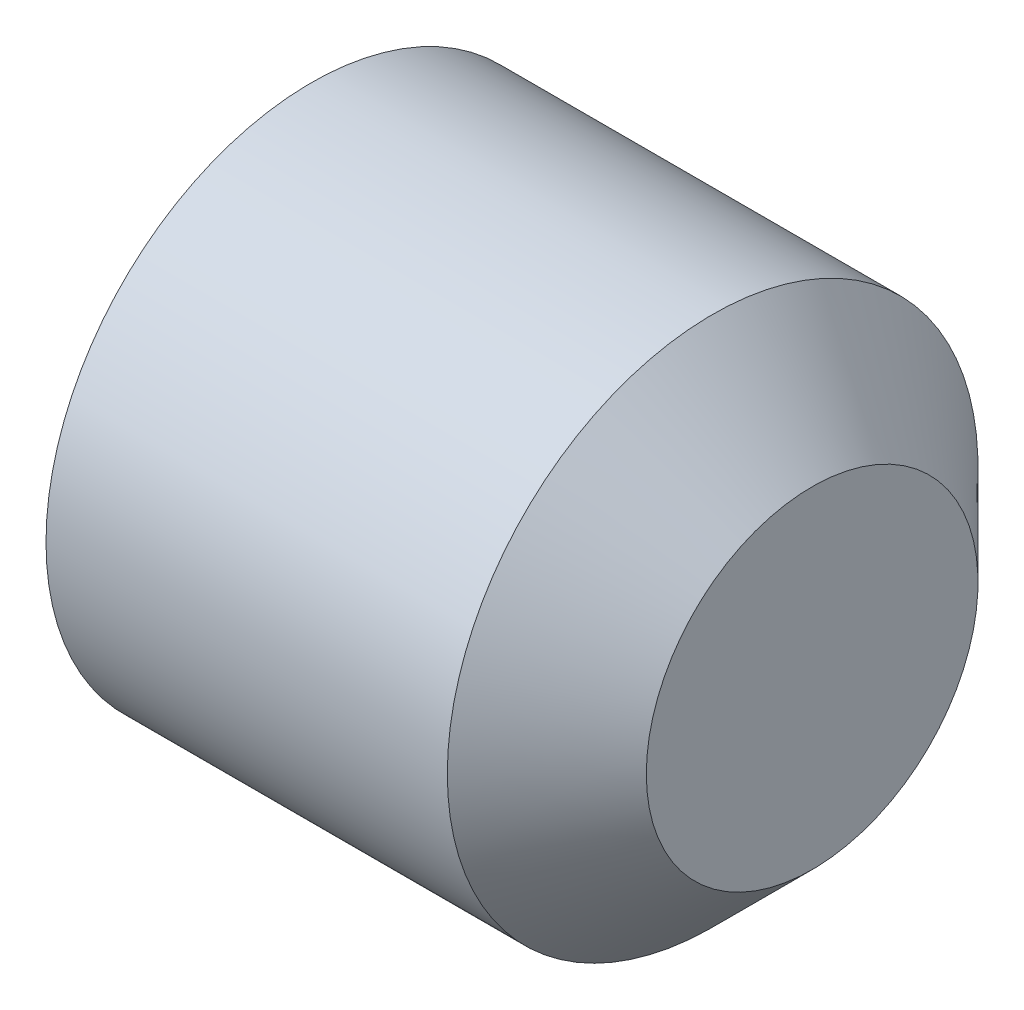
ISO-10303-21;
HEADER;
FILE_DESCRIPTION(('STEP AP214'),'2;1');
FILE_NAME('part.step','',(''),(''),'','','');
FILE_SCHEMA(('AUTOMOTIVE_DESIGN { 1 0 10303 214 1 1 1 1 }'));
ENDSEC;
DATA;
#1=APPLICATION_CONTEXT('core data for automotive mechanical design processes');
#2=APPLICATION_PROTOCOL_DEFINITION('international standard','automotive_design',2000,#1);
#3=PRODUCT_CONTEXT('',#1,'mechanical');
#4=PRODUCT('Part','Part','',(#3));
#5=PRODUCT_RELATED_PRODUCT_CATEGORY('part','',(#4));
#6=PRODUCT_DEFINITION_FORMATION('','',#4);
#7=PRODUCT_DEFINITION_CONTEXT('part definition',#1,'design');
#8=PRODUCT_DEFINITION('design','',#6,#7);
#9=PRODUCT_DEFINITION_SHAPE('','',#8);
#10=(LENGTH_UNIT() NAMED_UNIT(*) SI_UNIT(.MILLI.,.METRE.));
#11=(NAMED_UNIT(*) PLANE_ANGLE_UNIT() SI_UNIT($,.RADIAN.));
#12=(NAMED_UNIT(*) SI_UNIT($,.STERADIAN.) SOLID_ANGLE_UNIT());
#13=UNCERTAINTY_MEASURE_WITH_UNIT(LENGTH_MEASURE(1.E-05),#10,'distance_accuracy_value','');
#14=(GEOMETRIC_REPRESENTATION_CONTEXT(3) GLOBAL_UNCERTAINTY_ASSIGNED_CONTEXT((#13)) GLOBAL_UNIT_ASSIGNED_CONTEXT((#10,
#11,#12)) REPRESENTATION_CONTEXT('',''));
#15=CARTESIAN_POINT('',(0.,0.,0.));
#16=DIRECTION('',(0.,0.,1.));
#17=DIRECTION('',(1.,0.,0.));
#18=AXIS2_PLACEMENT_3D('',#15,#16,#17);
#19=CARTESIAN_POINT('',(0.,0.,0.));
#20=DIRECTION('',(-1.,0.,0.));
#21=DIRECTION('',(0.,0.,1.));
#22=AXIS2_PLACEMENT_3D('',#19,#20,#21);
#23=PLANE('',#22);
#24=CARTESIAN_POINT('',(0.,0.,0.));
#25=DIRECTION('',(-1.,0.,0.));
#26=DIRECTION('',(0.,0.,1.));
#27=AXIS2_PLACEMENT_3D('',#24,#25,#26);
#28=CIRCLE('',#27,1.61);
#29=CARTESIAN_POINT('',(0.,0.,1.61));
#30=VERTEX_POINT('',#29);
#31=EDGE_CURVE('E137',#30,#30,#28,.T.);
#32=ORIENTED_EDGE('',*,*,#31,.T.);
#33=EDGE_LOOP('',(#32));
#34=FACE_BOUND('',#33,.T.);
#35=DIRECTION('',(0.,0.,-1.));
#36=VECTOR('',#35,1.);
#37=CARTESIAN_POINT('',(0.,1.,0.577350269189622));
#38=LINE('',#37,#36);
#39=CARTESIAN_POINT('',(0.,1.,0.577350269189622));
#40=VERTEX_POINT('',#39);
#41=CARTESIAN_POINT('',(0.,1.,-0.577350269189629));
#42=VERTEX_POINT('',#41);
#43=EDGE_CURVE('E128',#40,#42,#38,.T.);
#44=ORIENTED_EDGE('',*,*,#43,.F.);
#45=DIRECTION('',(0.,-0.866025403784438,0.500000000000001));
#46=VECTOR('',#45,1.);
#47=CARTESIAN_POINT('',(0.,1.,0.577350269189622));
#48=LINE('',#47,#46);
#49=CARTESIAN_POINT('',(0.,0.,1.15470053837925));
#50=VERTEX_POINT('',#49);
#51=EDGE_CURVE('E50',#40,#50,#48,.T.);
#52=ORIENTED_EDGE('',*,*,#51,.T.);
#53=DIRECTION('',(0.,0.866025403784438,0.5));
#54=VECTOR('',#53,1.);
#55=CARTESIAN_POINT('',(0.,-0.999999999999996,0.577350269189623));
#56=LINE('',#55,#54);
#57=CARTESIAN_POINT('',(0.,-0.999999999999996,0.577350269189623));
#58=VERTEX_POINT('',#57);
#59=EDGE_CURVE('E119',#58,#50,#56,.T.);
#60=ORIENTED_EDGE('',*,*,#59,.F.);
#61=DIRECTION('',(0.,0.,-1.));
#62=VECTOR('',#61,1.);
#63=CARTESIAN_POINT('',(0.,-0.999999999999996,0.577350269189623));
#64=LINE('',#63,#62);
#65=CARTESIAN_POINT('',(0.,-0.999999999999996,-0.577350269189628));
#66=VERTEX_POINT('',#65);
#67=EDGE_CURVE('E122',#58,#66,#64,.T.);
#68=ORIENTED_EDGE('',*,*,#67,.T.);
#69=DIRECTION('',(0.,0.866025403784438,-0.500000000000001));
#70=VECTOR('',#69,1.);
#71=CARTESIAN_POINT('',(0.,-0.999999999999996,-0.577350269189628));
#72=LINE('',#71,#70);
#73=CARTESIAN_POINT('',(0.,0.,-1.15470053837925));
#74=VERTEX_POINT('',#73);
#75=EDGE_CURVE('E125',#66,#74,#72,.T.);
#76=ORIENTED_EDGE('',*,*,#75,.T.);
#77=DIRECTION('',(0.,-0.866025403784439,-0.5));
#78=VECTOR('',#77,1.);
#79=CARTESIAN_POINT('',(0.,1.,-0.577350269189629));
#80=LINE('',#79,#78);
#81=EDGE_CURVE('E108',#42,#74,#80,.T.);
#82=ORIENTED_EDGE('',*,*,#81,.F.);
#83=EDGE_LOOP('',(#44,#52,#60,#68,#76,#82));
#84=FACE_BOUND('',#83,.T.);
#85=ADVANCED_FACE('F35',(#34,#84),#23,.T.);
#86=CARTESIAN_POINT('',(4.,1.25,0.));
#87=DIRECTION('',(1.,0.,0.));
#88=DIRECTION('',(0.,0.,-1.));
#89=AXIS2_PLACEMENT_3D('',#86,#87,#88);
#90=PLANE('',#89);
#91=CARTESIAN_POINT('',(4.,0.,0.));
#92=DIRECTION('',(-1.,0.,0.));
#93=DIRECTION('',(0.,0.,1.));
#94=AXIS2_PLACEMENT_3D('',#91,#92,#93);
#95=CIRCLE('',#94,1.25);
#96=CARTESIAN_POINT('',(4.,0.,1.25));
#97=VERTEX_POINT('',#96);
#98=EDGE_CURVE('E11',#97,#97,#95,.T.);
#99=ORIENTED_EDGE('',*,*,#98,.F.);
#100=EDGE_LOOP('',(#99));
#101=FACE_BOUND('',#100,.T.);
#102=ADVANCED_FACE('F37',(#101),#90,.T.);
#103=CARTESIAN_POINT('',(3.25000000000001,0.,0.));
#104=DIRECTION('',(-1.,0.,0.));
#105=DIRECTION('',(0.,0.,1.));
#106=AXIS2_PLACEMENT_3D('',#103,#104,#105);
#107=CONICAL_SURFACE('',#106,2.,0.785398163397455);
#108=ORIENTED_EDGE('',*,*,#98,.T.);
#109=EDGE_LOOP('',(#108));
#110=FACE_BOUND('',#109,.T.);
#111=CARTESIAN_POINT('',(3.25000000000001,0.,0.));
#112=DIRECTION('',(-1.,0.,0.));
#113=DIRECTION('',(0.,0.,1.));
#114=AXIS2_PLACEMENT_3D('',#111,#112,#113);
#115=CIRCLE('',#114,2.);
#116=CARTESIAN_POINT('',(3.25000000000001,0.,2.));
#117=VERTEX_POINT('',#116);
#118=EDGE_CURVE('E43',#117,#117,#115,.T.);
#119=ORIENTED_EDGE('',*,*,#118,.F.);
#120=EDGE_LOOP('',(#119));
#121=FACE_BOUND('',#120,.T.);
#122=ADVANCED_FACE('F148',(#110,#121),#107,.T.);
#123=CARTESIAN_POINT('',(-12.7,0.,0.));
#124=DIRECTION('',(-1.,0.,0.));
#125=DIRECTION('',(0.,0.,1.));
#126=AXIS2_PLACEMENT_3D('',#123,#124,#125);
#127=CYLINDRICAL_SURFACE('',#126,2.);
#128=ORIENTED_EDGE('',*,*,#118,.T.);
#129=EDGE_LOOP('',(#128));
#130=FACE_BOUND('',#129,.T.);
#131=CARTESIAN_POINT('',(0.225166604983952,0.,0.));
#132=DIRECTION('',(-1.,0.,0.));
#133=DIRECTION('',(0.,0.,1.));
#134=AXIS2_PLACEMENT_3D('',#131,#132,#133);
#135=CIRCLE('',#134,2.);
#136=CARTESIAN_POINT('',(0.225166604983952,0.,2.));
#137=VERTEX_POINT('',#136);
#138=EDGE_CURVE('E140',#137,#137,#135,.T.);
#139=ORIENTED_EDGE('',*,*,#138,.F.);
#140=EDGE_LOOP('',(#139));
#141=FACE_BOUND('',#140,.T.);
#142=ADVANCED_FACE('F145',(#130,#141),#127,.T.);
#143=CARTESIAN_POINT('',(0.,0.,0.));
#144=DIRECTION('',(1.,0.,0.));
#145=DIRECTION('',(0.,0.,-1.));
#146=AXIS2_PLACEMENT_3D('',#143,#144,#145);
#147=CONICAL_SURFACE('',#146,1.61,1.0471975511966);
#148=ORIENTED_EDGE('',*,*,#138,.T.);
#149=EDGE_LOOP('',(#148));
#150=FACE_BOUND('',#149,.T.);
#151=ORIENTED_EDGE('',*,*,#31,.F.);
#152=EDGE_LOOP('',(#151));
#153=FACE_BOUND('',#152,.T.);
#154=ADVANCED_FACE('F155',(#150,#153),#147,.T.);
#155=CARTESIAN_POINT('',(1.8,1.,0.577350269189622));
#156=DIRECTION('',(0.,-0.500000000000001,-0.866025403784438));
#157=DIRECTION('',(0.,0.866025403784438,-0.500000000000001));
#158=AXIS2_PLACEMENT_3D('',#155,#156,#157);
#159=PLANE('',#158);
#160=ORIENTED_EDGE('',*,*,#51,.F.);
#161=DIRECTION('',(-1.,0.,0.));
#162=VECTOR('',#161,1.);
#163=CARTESIAN_POINT('',(1.8,1.,0.577350269189622));
#164=LINE('',#163,#162);
#165=CARTESIAN_POINT('',(1.8,1.,0.577350269189622));
#166=VERTEX_POINT('',#165);
#167=EDGE_CURVE('E55',#166,#40,#164,.T.);
#168=ORIENTED_EDGE('',*,*,#167,.F.);
#169=DIRECTION('',(0.,-0.866025403784438,0.500000000000001));
#170=VECTOR('',#169,1.);
#171=CARTESIAN_POINT('',(1.8,1.,0.577350269189622));
#172=LINE('',#171,#170);
#173=CARTESIAN_POINT('',(1.8,0.,1.15470053837925));
#174=VERTEX_POINT('',#173);
#175=EDGE_CURVE('E82',#166,#174,#172,.T.);
#176=ORIENTED_EDGE('',*,*,#175,.T.);
#177=DIRECTION('',(-1.,0.,0.));
#178=VECTOR('',#177,1.);
#179=CARTESIAN_POINT('',(1.8,0.,1.15470053837925));
#180=LINE('',#179,#178);
#181=EDGE_CURVE('E135',#174,#50,#180,.T.);
#182=ORIENTED_EDGE('',*,*,#181,.T.);
#183=EDGE_LOOP('',(#160,#168,#176,#182));
#184=FACE_BOUND('',#183,.T.);
#185=ADVANCED_FACE('F166',(#184),#159,.T.);
#186=CARTESIAN_POINT('',(1.8,-0.999999999999996,0.577350269189623));
#187=DIRECTION('',(0.,-0.5,0.866025403784439));
#188=DIRECTION('',(0.,-0.866025403784439,-0.5));
#189=AXIS2_PLACEMENT_3D('',#186,#187,#188);
#190=PLANE('',#189);
#191=ORIENTED_EDGE('',*,*,#59,.T.);
#192=ORIENTED_EDGE('',*,*,#181,.F.);
#193=DIRECTION('',(0.,0.866025403784438,0.5));
#194=VECTOR('',#193,1.);
#195=CARTESIAN_POINT('',(1.8,-0.999999999999996,0.577350269189623));
#196=LINE('',#195,#194);
#197=CARTESIAN_POINT('',(1.8,-0.999999999999996,0.577350269189623));
#198=VERTEX_POINT('',#197);
#199=EDGE_CURVE('E268',#198,#174,#196,.T.);
#200=ORIENTED_EDGE('',*,*,#199,.F.);
#201=DIRECTION('',(-1.,0.,0.));
#202=VECTOR('',#201,1.);
#203=CARTESIAN_POINT('',(1.8,-0.999999999999996,0.577350269189623));
#204=LINE('',#203,#202);
#205=EDGE_CURVE('E133',#198,#58,#204,.T.);
#206=ORIENTED_EDGE('',*,*,#205,.T.);
#207=EDGE_LOOP('',(#191,#192,#200,#206));
#208=FACE_BOUND('',#207,.T.);
#209=ADVANCED_FACE('F173',(#208),#190,.F.);
#210=CARTESIAN_POINT('',(1.8,-0.999999999999996,0.577350269189623));
#211=DIRECTION('',(0.,1.,0.));
#212=DIRECTION('',(0.,0.,1.));
#213=AXIS2_PLACEMENT_3D('',#210,#211,#212);
#214=PLANE('',#213);
#215=ORIENTED_EDGE('',*,*,#67,.F.);
#216=ORIENTED_EDGE('',*,*,#205,.F.);
#217=DIRECTION('',(0.,0.,-1.));
#218=VECTOR('',#217,1.);
#219=CARTESIAN_POINT('',(1.8,-0.999999999999996,0.577350269189623));
#220=LINE('',#219,#218);
#221=CARTESIAN_POINT('',(1.8,-0.999999999999996,-0.577350269189628));
#222=VERTEX_POINT('',#221);
#223=EDGE_CURVE('E103',#198,#222,#220,.T.);
#224=ORIENTED_EDGE('',*,*,#223,.T.);
#225=DIRECTION('',(-1.,0.,0.));
#226=VECTOR('',#225,1.);
#227=CARTESIAN_POINT('',(1.8,-0.999999999999996,-0.577350269189628));
#228=LINE('',#227,#226);
#229=EDGE_CURVE('E98',#222,#66,#228,.T.);
#230=ORIENTED_EDGE('',*,*,#229,.T.);
#231=EDGE_LOOP('',(#215,#216,#224,#230));
#232=FACE_BOUND('',#231,.T.);
#233=ADVANCED_FACE('F180',(#232),#214,.T.);
#234=CARTESIAN_POINT('',(1.8,-0.999999999999996,-0.577350269189628));
#235=DIRECTION('',(0.,0.500000000000001,0.866025403784438));
#236=DIRECTION('',(0.,-0.866025403784438,0.500000000000001));
#237=AXIS2_PLACEMENT_3D('',#234,#235,#236);
#238=PLANE('',#237);
#239=ORIENTED_EDGE('',*,*,#75,.F.);
#240=ORIENTED_EDGE('',*,*,#229,.F.);
#241=DIRECTION('',(0.,0.866025403784438,-0.500000000000001));
#242=VECTOR('',#241,1.);
#243=CARTESIAN_POINT('',(1.8,-0.999999999999996,-0.577350269189628));
#244=LINE('',#243,#242);
#245=CARTESIAN_POINT('',(1.8,0.,-1.15470053837925));
#246=VERTEX_POINT('',#245);
#247=EDGE_CURVE('E93',#222,#246,#244,.T.);
#248=ORIENTED_EDGE('',*,*,#247,.T.);
#249=DIRECTION('',(-1.,0.,0.));
#250=VECTOR('',#249,1.);
#251=CARTESIAN_POINT('',(1.8,0.,-1.15470053837925));
#252=LINE('',#251,#250);
#253=EDGE_CURVE('E97',#246,#74,#252,.T.);
#254=ORIENTED_EDGE('',*,*,#253,.T.);
#255=EDGE_LOOP('',(#239,#240,#248,#254));
#256=FACE_BOUND('',#255,.T.);
#257=ADVANCED_FACE('F96',(#256),#238,.T.);
#258=CARTESIAN_POINT('',(1.8,1.,-0.577350269189629));
#259=DIRECTION('',(0.,0.5,-0.866025403784439));
#260=DIRECTION('',(0.,0.866025403784439,0.5));
#261=AXIS2_PLACEMENT_3D('',#258,#259,#260);
#262=PLANE('',#261);
#263=ORIENTED_EDGE('',*,*,#81,.T.);
#264=ORIENTED_EDGE('',*,*,#253,.F.);
#265=DIRECTION('',(0.,-0.866025403784439,-0.5));
#266=VECTOR('',#265,1.);
#267=CARTESIAN_POINT('',(1.8,1.,-0.577350269189629));
#268=LINE('',#267,#266);
#269=CARTESIAN_POINT('',(1.8,1.,-0.577350269189629));
#270=VERTEX_POINT('',#269);
#271=EDGE_CURVE('E102',#270,#246,#268,.T.);
#272=ORIENTED_EDGE('',*,*,#271,.F.);
#273=DIRECTION('',(-1.,0.,0.));
#274=VECTOR('',#273,1.);
#275=CARTESIAN_POINT('',(1.8,1.,-0.577350269189629));
#276=LINE('',#275,#274);
#277=EDGE_CURVE('E78',#270,#42,#276,.T.);
#278=ORIENTED_EDGE('',*,*,#277,.T.);
#279=EDGE_LOOP('',(#263,#264,#272,#278));
#280=FACE_BOUND('',#279,.T.);
#281=ADVANCED_FACE('F105',(#280),#262,.F.);
#282=CARTESIAN_POINT('',(1.8,1.,0.577350269189622));
#283=DIRECTION('',(0.,1.,0.));
#284=DIRECTION('',(0.,0.,1.));
#285=AXIS2_PLACEMENT_3D('',#282,#283,#284);
#286=PLANE('',#285);
#287=ORIENTED_EDGE('',*,*,#43,.T.);
#288=ORIENTED_EDGE('',*,*,#277,.F.);
#289=DIRECTION('',(0.,0.,-1.));
#290=VECTOR('',#289,1.);
#291=CARTESIAN_POINT('',(1.8,1.,0.577350269189622));
#292=LINE('',#291,#290);
#293=EDGE_CURVE('E113',#166,#270,#292,.T.);
#294=ORIENTED_EDGE('',*,*,#293,.F.);
#295=ORIENTED_EDGE('',*,*,#167,.T.);
#296=EDGE_LOOP('',(#287,#288,#294,#295));
#297=FACE_BOUND('',#296,.T.);
#298=ADVANCED_FACE('F192',(#297),#286,.F.);
#299=CARTESIAN_POINT('',(1.8,0.,1.15470053837925));
#300=DIRECTION('',(-1.,0.,0.));
#301=DIRECTION('',(0.,0.,1.));
#302=AXIS2_PLACEMENT_3D('',#299,#300,#301);
#303=PLANE('',#302);
#304=ORIENTED_EDGE('',*,*,#175,.F.);
#305=ORIENTED_EDGE('',*,*,#293,.T.);
#306=ORIENTED_EDGE('',*,*,#271,.T.);
#307=ORIENTED_EDGE('',*,*,#247,.F.);
#308=ORIENTED_EDGE('',*,*,#223,.F.);
#309=ORIENTED_EDGE('',*,*,#199,.T.);
#310=EDGE_LOOP('',(#304,#305,#306,#307,#308,#309));
#311=FACE_BOUND('',#310,.T.);
#312=ADVANCED_FACE('F111',(#311),#303,.T.);
#313=CLOSED_SHELL('',(#85,#102,#122,#142,#154,#185,#209,#233,#257,#281,#298,#312));
#314=MANIFOLD_SOLID_BREP('B2',#313);
#315=ADVANCED_BREP_SHAPE_REPRESENTATION('',(#18,#314),#14);
#316=SHAPE_DEFINITION_REPRESENTATION(#9,#315);
ENDSEC;
END-ISO-10303-21;
